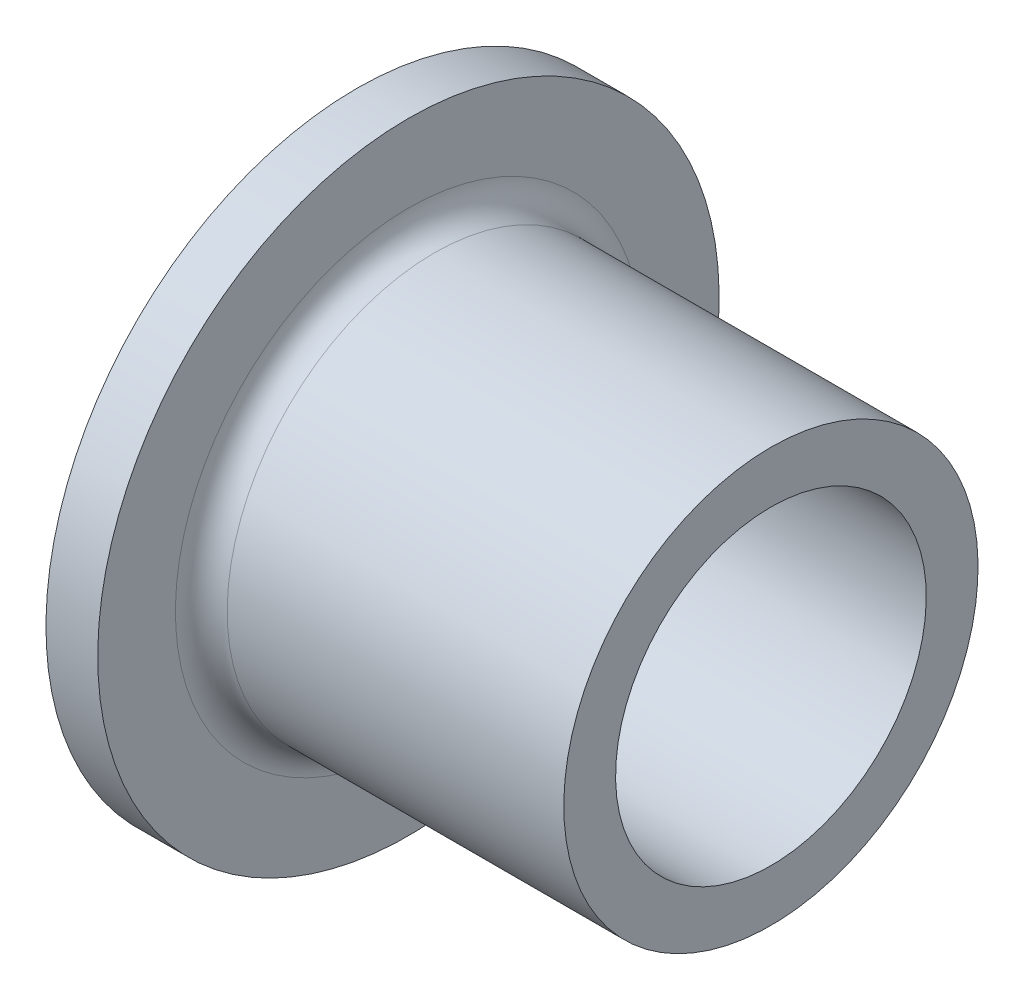
ISO-10303-21;
HEADER;
FILE_DESCRIPTION(('STEP AP214'),'2;1');
FILE_NAME('part.step','',(''),(''),'','','');
FILE_SCHEMA(('AUTOMOTIVE_DESIGN { 1 0 10303 214 1 1 1 1 }'));
ENDSEC;
DATA;
#1=APPLICATION_CONTEXT('core data for automotive mechanical design processes');
#2=APPLICATION_PROTOCOL_DEFINITION('international standard','automotive_design',2000,#1);
#3=PRODUCT_CONTEXT('',#1,'mechanical');
#4=PRODUCT('Part','Part','',(#3));
#5=PRODUCT_RELATED_PRODUCT_CATEGORY('part','',(#4));
#6=PRODUCT_DEFINITION_FORMATION('','',#4);
#7=PRODUCT_DEFINITION_CONTEXT('part definition',#1,'design');
#8=PRODUCT_DEFINITION('design','',#6,#7);
#9=PRODUCT_DEFINITION_SHAPE('','',#8);
#10=(LENGTH_UNIT() NAMED_UNIT(*) SI_UNIT(.MILLI.,.METRE.));
#11=(NAMED_UNIT(*) PLANE_ANGLE_UNIT() SI_UNIT($,.RADIAN.));
#12=(NAMED_UNIT(*) SI_UNIT($,.STERADIAN.) SOLID_ANGLE_UNIT());
#13=UNCERTAINTY_MEASURE_WITH_UNIT(LENGTH_MEASURE(1.E-05),#10,'distance_accuracy_value','');
#14=(GEOMETRIC_REPRESENTATION_CONTEXT(3) GLOBAL_UNCERTAINTY_ASSIGNED_CONTEXT((#13)) GLOBAL_UNIT_ASSIGNED_CONTEXT((#10,
#11,#12)) REPRESENTATION_CONTEXT('',''));
#15=CARTESIAN_POINT('',(0.,0.,0.));
#16=DIRECTION('',(0.,0.,1.));
#17=DIRECTION('',(1.,0.,0.));
#18=AXIS2_PLACEMENT_3D('',#15,#16,#17);
#19=CARTESIAN_POINT('',(-8.,5.25,0.));
#20=DIRECTION('',(-1.,0.,0.));
#21=DIRECTION('',(0.,0.,1.));
#22=AXIS2_PLACEMENT_3D('',#19,#20,#21);
#23=PLANE('',#22);
#24=CARTESIAN_POINT('',(-8.,0.,0.));
#25=DIRECTION('',(-1.,0.,0.));
#26=DIRECTION('',(0.,1.,0.));
#27=AXIS2_PLACEMENT_3D('',#24,#25,#26);
#28=CIRCLE('',#27,4.5);
#29=CARTESIAN_POINT('',(-8.,4.5,0.));
#30=VERTEX_POINT('',#29);
#31=EDGE_CURVE('E118',#30,#30,#28,.T.);
#32=ORIENTED_EDGE('',*,*,#31,.F.);
#33=EDGE_LOOP('',(#32));
#34=FACE_BOUND('',#33,.T.);
#35=CARTESIAN_POINT('',(-8.,0.,0.));
#36=DIRECTION('',(1.,0.,0.));
#37=DIRECTION('',(0.,1.,0.));
#38=AXIS2_PLACEMENT_3D('',#35,#36,#37);
#39=CIRCLE('',#38,6.);
#40=CARTESIAN_POINT('',(-8.,6.,0.));
#41=VERTEX_POINT('',#40);
#42=EDGE_CURVE('E19',#41,#41,#39,.T.);
#43=ORIENTED_EDGE('',*,*,#42,.F.);
#44=EDGE_LOOP('',(#43));
#45=FACE_BOUND('',#44,.T.);
#46=ADVANCED_FACE('F15',(#34,#45),#23,.T.);
#47=CARTESIAN_POINT('',(-6.5,0.,0.));
#48=DIRECTION('',(1.,0.,0.));
#49=DIRECTION('',(0.,0.,-1.));
#50=AXIS2_PLACEMENT_3D('',#47,#48,#49);
#51=TOROIDAL_SURFACE('',#50,4.5,1.5);
#52=CARTESIAN_POINT('',(-6.5,0.,0.));
#53=DIRECTION('',(1.,0.,0.));
#54=DIRECTION('',(0.,1.,0.));
#55=AXIS2_PLACEMENT_3D('',#52,#53,#54);
#56=CIRCLE('',#55,3.);
#57=CARTESIAN_POINT('',(-6.5,3.,0.));
#58=VERTEX_POINT('',#57);
#59=EDGE_CURVE('E53',#58,#58,#56,.T.);
#60=ORIENTED_EDGE('',*,*,#59,.T.);
#61=EDGE_LOOP('',(#60));
#62=FACE_BOUND('',#61,.T.);
#63=ORIENTED_EDGE('',*,*,#31,.T.);
#64=EDGE_LOOP('',(#63));
#65=FACE_BOUND('',#64,.T.);
#66=ADVANCED_FACE('F68',(#62,#65),#51,.T.);
#67=CARTESIAN_POINT('',(-7.5,0.,0.));
#68=DIRECTION('',(1.,0.,0.));
#69=DIRECTION('',(0.,1.,0.));
#70=AXIS2_PLACEMENT_3D('',#67,#68,#69);
#71=CYLINDRICAL_SURFACE('',#70,6.);
#72=ORIENTED_EDGE('',*,*,#42,.T.);
#73=EDGE_LOOP('',(#72));
#74=FACE_BOUND('',#73,.T.);
#75=CARTESIAN_POINT('',(-7.,0.,0.));
#76=DIRECTION('',(1.,0.,0.));
#77=DIRECTION('',(0.,1.,0.));
#78=AXIS2_PLACEMENT_3D('',#75,#76,#77);
#79=CIRCLE('',#78,6.);
#80=CARTESIAN_POINT('',(-7.,6.,0.));
#81=VERTEX_POINT('',#80);
#82=EDGE_CURVE('E61',#81,#81,#79,.T.);
#83=ORIENTED_EDGE('',*,*,#82,.F.);
#84=EDGE_LOOP('',(#83));
#85=FACE_BOUND('',#84,.T.);
#86=ADVANCED_FACE('F72',(#74,#85),#71,.T.);
#87=CARTESIAN_POINT('',(-3.25,0.,0.));
#88=DIRECTION('',(1.,0.,0.));
#89=DIRECTION('',(0.,1.,0.));
#90=AXIS2_PLACEMENT_3D('',#87,#88,#89);
#91=CYLINDRICAL_SURFACE('',#90,3.);
#92=CARTESIAN_POINT('',(0.,0.,0.));
#93=DIRECTION('',(1.,0.,0.));
#94=DIRECTION('',(0.,1.,0.));
#95=AXIS2_PLACEMENT_3D('',#92,#93,#94);
#96=CIRCLE('',#95,3.);
#97=CARTESIAN_POINT('',(0.,3.,0.));
#98=VERTEX_POINT('',#97);
#99=EDGE_CURVE('E86',#98,#98,#96,.F.);
#100=ORIENTED_EDGE('',*,*,#99,.F.);
#101=EDGE_LOOP('',(#100));
#102=FACE_BOUND('',#101,.T.);
#103=ORIENTED_EDGE('',*,*,#59,.F.);
#104=EDGE_LOOP('',(#103));
#105=FACE_BOUND('',#104,.T.);
#106=ADVANCED_FACE('F94',(#102,#105),#91,.F.);
#107=CARTESIAN_POINT('',(-7.,5.25,0.));
#108=DIRECTION('',(1.,0.,0.));
#109=DIRECTION('',(0.,0.,-1.));
#110=AXIS2_PLACEMENT_3D('',#107,#108,#109);
#111=PLANE('',#110);
#112=CARTESIAN_POINT('',(-7.,0.,0.));
#113=DIRECTION('',(1.,0.,0.));
#114=DIRECTION('',(0.,1.,0.));
#115=AXIS2_PLACEMENT_3D('',#112,#113,#114);
#116=CIRCLE('',#115,4.5);
#117=CARTESIAN_POINT('',(-7.,4.5,0.));
#118=VERTEX_POINT('',#117);
#119=EDGE_CURVE('E28',#118,#118,#116,.F.);
#120=ORIENTED_EDGE('',*,*,#119,.T.);
#121=EDGE_LOOP('',(#120));
#122=FACE_BOUND('',#121,.T.);
#123=ORIENTED_EDGE('',*,*,#82,.T.);
#124=EDGE_LOOP('',(#123));
#125=FACE_BOUND('',#124,.T.);
#126=ADVANCED_FACE('F91',(#122,#125),#111,.T.);
#127=CARTESIAN_POINT('',(0.,3.5,0.));
#128=DIRECTION('',(1.,0.,0.));
#129=DIRECTION('',(0.,0.,-1.));
#130=AXIS2_PLACEMENT_3D('',#127,#128,#129);
#131=PLANE('',#130);
#132=ORIENTED_EDGE('',*,*,#99,.T.);
#133=EDGE_LOOP('',(#132));
#134=FACE_BOUND('',#133,.T.);
#135=CARTESIAN_POINT('',(0.,0.,0.));
#136=DIRECTION('',(1.,0.,0.));
#137=DIRECTION('',(0.,1.,0.));
#138=AXIS2_PLACEMENT_3D('',#135,#136,#137);
#139=CIRCLE('',#138,4.);
#140=CARTESIAN_POINT('',(0.,4.,0.));
#141=VERTEX_POINT('',#140);
#142=EDGE_CURVE('E23',#141,#141,#139,.F.);
#143=ORIENTED_EDGE('',*,*,#142,.F.);
#144=EDGE_LOOP('',(#143));
#145=FACE_BOUND('',#144,.T.);
#146=ADVANCED_FACE('F44',(#134,#145),#131,.T.);
#147=CARTESIAN_POINT('',(-6.5,0.,0.));
#148=DIRECTION('',(1.,0.,0.));
#149=DIRECTION('',(0.,0.,-1.));
#150=AXIS2_PLACEMENT_3D('',#147,#148,#149);
#151=TOROIDAL_SURFACE('',#150,4.5,0.499999999999999);
#152=ORIENTED_EDGE('',*,*,#119,.F.);
#153=EDGE_LOOP('',(#152));
#154=FACE_BOUND('',#153,.T.);
#155=CARTESIAN_POINT('',(-6.5,0.,0.));
#156=DIRECTION('',(1.,0.,0.));
#157=DIRECTION('',(0.,1.,0.));
#158=AXIS2_PLACEMENT_3D('',#155,#156,#157);
#159=CIRCLE('',#158,4.);
#160=CARTESIAN_POINT('',(-6.5,4.,0.));
#161=VERTEX_POINT('',#160);
#162=EDGE_CURVE('E10',#161,#161,#159,.T.);
#163=ORIENTED_EDGE('',*,*,#162,.F.);
#164=EDGE_LOOP('',(#163));
#165=FACE_BOUND('',#164,.T.);
#166=ADVANCED_FACE('F38',(#154,#165),#151,.F.);
#167=CARTESIAN_POINT('',(-3.25,0.,0.));
#168=DIRECTION('',(1.,0.,0.));
#169=DIRECTION('',(0.,1.,0.));
#170=AXIS2_PLACEMENT_3D('',#167,#168,#169);
#171=CYLINDRICAL_SURFACE('',#170,4.);
#172=ORIENTED_EDGE('',*,*,#162,.T.);
#173=EDGE_LOOP('',(#172));
#174=FACE_BOUND('',#173,.T.);
#175=ORIENTED_EDGE('',*,*,#142,.T.);
#176=EDGE_LOOP('',(#175));
#177=FACE_BOUND('',#176,.T.);
#178=ADVANCED_FACE('F43',(#174,#177),#171,.T.);
#179=CLOSED_SHELL('',(#46,#66,#86,#106,#126,#146,#166,#178));
#180=MANIFOLD_SOLID_BREP('B1',#179);
#181=ADVANCED_BREP_SHAPE_REPRESENTATION('',(#18,#180),#14);
#182=SHAPE_DEFINITION_REPRESENTATION(#9,#181);
ENDSEC;
END-ISO-10303-21;
